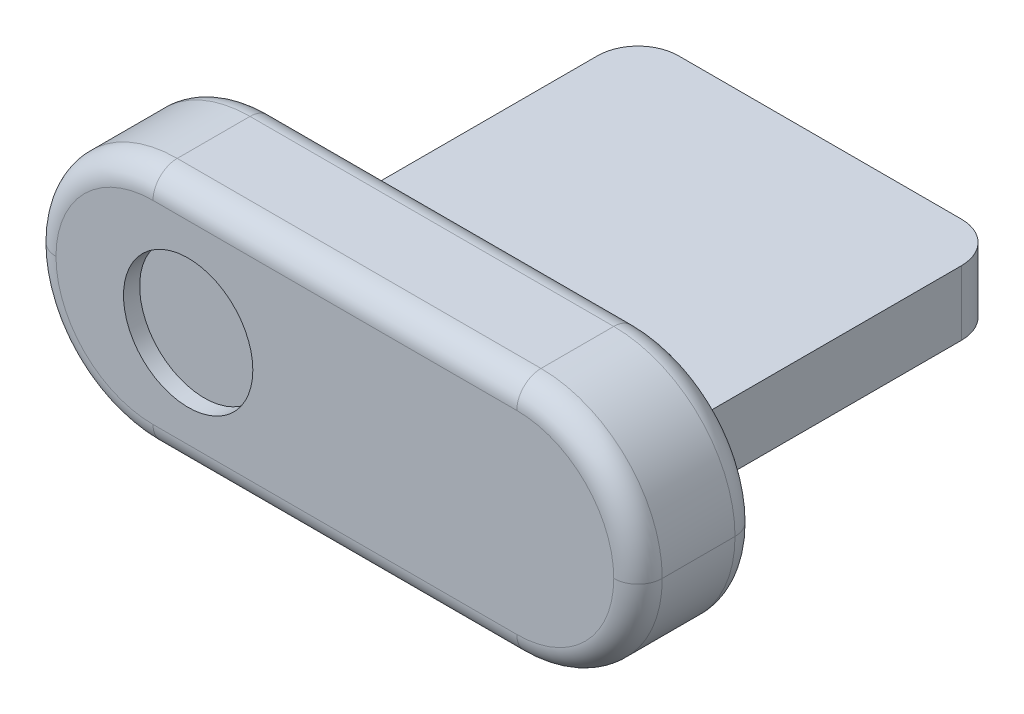
ISO-10303-21;
HEADER;
FILE_DESCRIPTION(('STEP AP214'),'2;1');
FILE_NAME('part.step','',(''),(''),'','','');
FILE_SCHEMA(('AUTOMOTIVE_DESIGN { 1 0 10303 214 1 1 1 1 }'));
ENDSEC;
DATA;
#1=APPLICATION_CONTEXT('core data for automotive mechanical design processes');
#2=APPLICATION_PROTOCOL_DEFINITION('international standard','automotive_design',2000,#1);
#3=PRODUCT_CONTEXT('',#1,'mechanical');
#4=PRODUCT('Part','Part','',(#3));
#5=PRODUCT_RELATED_PRODUCT_CATEGORY('part','',(#4));
#6=PRODUCT_DEFINITION_FORMATION('','',#4);
#7=PRODUCT_DEFINITION_CONTEXT('part definition',#1,'design');
#8=PRODUCT_DEFINITION('design','',#6,#7);
#9=PRODUCT_DEFINITION_SHAPE('','',#8);
#10=(LENGTH_UNIT() NAMED_UNIT(*) SI_UNIT(.MILLI.,.METRE.));
#11=(NAMED_UNIT(*) PLANE_ANGLE_UNIT() SI_UNIT($,.RADIAN.));
#12=(NAMED_UNIT(*) SI_UNIT($,.STERADIAN.) SOLID_ANGLE_UNIT());
#13=UNCERTAINTY_MEASURE_WITH_UNIT(LENGTH_MEASURE(1.E-05),#10,'distance_accuracy_value','');
#14=(GEOMETRIC_REPRESENTATION_CONTEXT(3) GLOBAL_UNCERTAINTY_ASSIGNED_CONTEXT((#13)) GLOBAL_UNIT_ASSIGNED_CONTEXT((#10,
#11,#12)) REPRESENTATION_CONTEXT('',''));
#15=CARTESIAN_POINT('',(0.,0.,0.));
#16=DIRECTION('',(0.,0.,1.));
#17=DIRECTION('',(1.,0.,0.));
#18=AXIS2_PLACEMENT_3D('',#15,#16,#17);
#19=CARTESIAN_POINT('',(0.,0.,-15.));
#20=DIRECTION('',(0.,0.,1.));
#21=DIRECTION('',(1.,0.,0.));
#22=AXIS2_PLACEMENT_3D('',#19,#20,#21);
#23=PLANE('',#22);
#24=DIRECTION('',(-1.,0.,0.));
#25=VECTOR('',#24,1.);
#26=CARTESIAN_POINT('',(-17.5,35.5297881504023,-15.));
#27=LINE('',#26,#25);
#28=CARTESIAN_POINT('',(-62.5,35.5297881504023,-15.));
#29=VERTEX_POINT('',#28);
#30=CARTESIAN_POINT('',(-17.5,35.5297881504023,-15.));
#31=VERTEX_POINT('',#30);
#32=EDGE_CURVE('E237',#29,#31,#27,.F.);
#33=ORIENTED_EDGE('',*,*,#32,.T.);
#34=CARTESIAN_POINT('',(-17.5,23.5297881504023,-15.));
#35=DIRECTION('',(0.,0.,1.));
#36=DIRECTION('',(1.,0.,0.));
#37=AXIS2_PLACEMENT_3D('',#34,#35,#36);
#38=CIRCLE('',#37,12.);
#39=CARTESIAN_POINT('',(-5.50000000000002,23.5297881504023,-15.));
#40=VERTEX_POINT('',#39);
#41=EDGE_CURVE('E250',#31,#40,#38,.F.);
#42=ORIENTED_EDGE('',*,*,#41,.T.);
#43=CARTESIAN_POINT('',(-17.5,23.5297881504024,-15.));
#44=DIRECTION('',(0.,0.,1.));
#45=DIRECTION('',(1.,0.,0.));
#46=AXIS2_PLACEMENT_3D('',#43,#44,#45);
#47=CIRCLE('',#46,12.);
#48=CARTESIAN_POINT('',(-17.5,11.5297881504024,-15.));
#49=VERTEX_POINT('',#48);
#50=EDGE_CURVE('E247',#40,#49,#47,.F.);
#51=ORIENTED_EDGE('',*,*,#50,.T.);
#52=DIRECTION('',(1.,0.,0.));
#53=VECTOR('',#52,1.);
#54=CARTESIAN_POINT('',(-62.5,11.5297881504024,-15.));
#55=LINE('',#54,#53);
#56=CARTESIAN_POINT('',(-62.5,11.5297881504024,-15.));
#57=VERTEX_POINT('',#56);
#58=EDGE_CURVE('E244',#49,#57,#55,.F.);
#59=ORIENTED_EDGE('',*,*,#58,.T.);
#60=CARTESIAN_POINT('',(-62.5,23.5297881504024,-15.));
#61=DIRECTION('',(0.,0.,1.));
#62=DIRECTION('',(1.,0.,0.));
#63=AXIS2_PLACEMENT_3D('',#60,#61,#62);
#64=CIRCLE('',#63,12.);
#65=CARTESIAN_POINT('',(-74.5,23.5297881504024,-15.));
#66=VERTEX_POINT('',#65);
#67=EDGE_CURVE('E242',#57,#66,#64,.F.);
#68=ORIENTED_EDGE('',*,*,#67,.T.);
#69=CARTESIAN_POINT('',(-62.5,23.5297881504024,-15.));
#70=DIRECTION('',(0.,0.,1.));
#71=DIRECTION('',(1.,0.,0.));
#72=AXIS2_PLACEMENT_3D('',#69,#70,#71);
#73=CIRCLE('',#72,12.);
#74=EDGE_CURVE('E240',#66,#29,#73,.F.);
#75=ORIENTED_EDGE('',*,*,#74,.T.);
#76=EDGE_LOOP('',(#33,#42,#51,#59,#68,#75));
#77=FACE_BOUND('',#76,.T.);
#78=DIRECTION('',(0.,-1.,0.));
#79=VECTOR('',#78,1.);
#80=CARTESIAN_POINT('',(-17.5,23.5297881504023,-15.));
#81=LINE('',#80,#79);
#82=CARTESIAN_POINT('',(-17.5,23.5297881504023,-15.));
#83=VERTEX_POINT('',#82);
#84=CARTESIAN_POINT('',(-17.5,15.5297881504023,-15.));
#85=VERTEX_POINT('',#84);
#86=EDGE_CURVE('E176',#83,#85,#81,.T.);
#87=ORIENTED_EDGE('',*,*,#86,.F.);
#88=DIRECTION('',(-1.,0.,0.));
#89=VECTOR('',#88,1.);
#90=CARTESIAN_POINT('',(-17.5,23.5297881504023,-15.));
#91=LINE('',#90,#89);
#92=CARTESIAN_POINT('',(-62.5,23.5297881504023,-15.));
#93=VERTEX_POINT('',#92);
#94=EDGE_CURVE('E189',#83,#93,#91,.T.);
#95=ORIENTED_EDGE('',*,*,#94,.T.);
#96=DIRECTION('',(0.,-1.,0.));
#97=VECTOR('',#96,1.);
#98=CARTESIAN_POINT('',(-62.5,23.5297881504023,-15.));
#99=LINE('',#98,#97);
#100=CARTESIAN_POINT('',(-62.5,15.5297881504023,-15.));
#101=VERTEX_POINT('',#100);
#102=EDGE_CURVE('E187',#93,#101,#99,.T.);
#103=ORIENTED_EDGE('',*,*,#102,.T.);
#104=DIRECTION('',(-1.,0.,0.));
#105=VECTOR('',#104,1.);
#106=CARTESIAN_POINT('',(-17.5,15.5297881504023,-15.));
#107=LINE('',#106,#105);
#108=EDGE_CURVE('E165',#85,#101,#107,.T.);
#109=ORIENTED_EDGE('',*,*,#108,.F.);
#110=EDGE_LOOP('',(#87,#95,#103,#109));
#111=FACE_BOUND('',#110,.T.);
#112=ADVANCED_FACE('F34',(#77,#111),#23,.F.);
#113=CARTESIAN_POINT('',(-77.5,38.5297881504024,-15.));
#114=DIRECTION('',(0.,1.,0.));
#115=DIRECTION('',(-1.,0.,0.));
#116=AXIS2_PLACEMENT_3D('',#113,#114,#115);
#117=PLANE('',#116);
#118=DIRECTION('',(0.,0.,1.));
#119=VECTOR('',#118,1.);
#120=CARTESIAN_POINT('',(-17.5,38.5297881504023,-15.));
#121=LINE('',#120,#119);
#122=CARTESIAN_POINT('',(-17.5,38.5297881504023,-3.));
#123=VERTEX_POINT('',#122);
#124=CARTESIAN_POINT('',(-17.5,38.5297881504023,-12.));
#125=VERTEX_POINT('',#124);
#126=EDGE_CURVE('E210',#123,#125,#121,.F.);
#127=ORIENTED_EDGE('',*,*,#126,.T.);
#128=DIRECTION('',(-1.,0.,0.));
#129=VECTOR('',#128,1.);
#130=CARTESIAN_POINT('',(-62.5,38.5297881504024,-12.));
#131=LINE('',#130,#129);
#132=CARTESIAN_POINT('',(-62.5,38.5297881504024,-12.));
#133=VERTEX_POINT('',#132);
#134=EDGE_CURVE('E11',#125,#133,#131,.T.);
#135=ORIENTED_EDGE('',*,*,#134,.T.);
#136=DIRECTION('',(0.,0.,1.));
#137=VECTOR('',#136,1.);
#138=CARTESIAN_POINT('',(-62.5,38.5297881504024,-15.));
#139=LINE('',#138,#137);
#140=CARTESIAN_POINT('',(-62.5,38.5297881504024,-3.));
#141=VERTEX_POINT('',#140);
#142=EDGE_CURVE('E213',#133,#141,#139,.T.);
#143=ORIENTED_EDGE('',*,*,#142,.T.);
#144=DIRECTION('',(-1.,0.,0.));
#145=VECTOR('',#144,1.);
#146=CARTESIAN_POINT('',(-77.5,38.5297881504024,-3.));
#147=LINE('',#146,#145);
#148=EDGE_CURVE('E43',#141,#123,#147,.F.);
#149=ORIENTED_EDGE('',*,*,#148,.T.);
#150=EDGE_LOOP('',(#127,#135,#143,#149));
#151=FACE_BOUND('',#150,.T.);
#152=ADVANCED_FACE('F391',(#151),#117,.T.);
#153=CARTESIAN_POINT('',(-77.5,8.52978815040235,-15.));
#154=DIRECTION('',(0.,-1.,0.));
#155=DIRECTION('',(0.,0.,-1.));
#156=AXIS2_PLACEMENT_3D('',#153,#154,#155);
#157=PLANE('',#156);
#158=DIRECTION('',(0.,0.,1.));
#159=VECTOR('',#158,1.);
#160=CARTESIAN_POINT('',(-62.5,8.52978815040235,-15.));
#161=LINE('',#160,#159);
#162=CARTESIAN_POINT('',(-62.5,8.52978815040235,-3.));
#163=VERTEX_POINT('',#162);
#164=CARTESIAN_POINT('',(-62.5,8.52978815040235,-12.));
#165=VERTEX_POINT('',#164);
#166=EDGE_CURVE('E206',#163,#165,#161,.F.);
#167=ORIENTED_EDGE('',*,*,#166,.T.);
#168=DIRECTION('',(1.,0.,0.));
#169=VECTOR('',#168,1.);
#170=CARTESIAN_POINT('',(-17.5,8.52978815040235,-12.));
#171=LINE('',#170,#169);
#172=CARTESIAN_POINT('',(-17.5,8.52978815040235,-12.));
#173=VERTEX_POINT('',#172);
#174=EDGE_CURVE('E270',#165,#173,#171,.T.);
#175=ORIENTED_EDGE('',*,*,#174,.T.);
#176=DIRECTION('',(0.,0.,1.));
#177=VECTOR('',#176,1.);
#178=CARTESIAN_POINT('',(-17.5,8.52978815040235,-15.));
#179=LINE('',#178,#177);
#180=CARTESIAN_POINT('',(-17.5,8.52978815040235,-3.));
#181=VERTEX_POINT('',#180);
#182=EDGE_CURVE('E203',#173,#181,#179,.T.);
#183=ORIENTED_EDGE('',*,*,#182,.T.);
#184=DIRECTION('',(1.,0.,0.));
#185=VECTOR('',#184,1.);
#186=CARTESIAN_POINT('',(-77.5,8.52978815040235,-3.));
#187=LINE('',#186,#185);
#188=EDGE_CURVE('E267',#181,#163,#187,.F.);
#189=ORIENTED_EDGE('',*,*,#188,.T.);
#190=EDGE_LOOP('',(#167,#175,#183,#189));
#191=FACE_BOUND('',#190,.T.);
#192=ADVANCED_FACE('F369',(#191),#157,.T.);
#193=CARTESIAN_POINT('',(0.,0.,0.));
#194=DIRECTION('',(0.,0.,1.));
#195=DIRECTION('',(1.,0.,0.));
#196=AXIS2_PLACEMENT_3D('',#193,#194,#195);
#197=PLANE('',#196);
#198=CARTESIAN_POINT('',(-58.1483797005973,23.5297881504024,0.));
#199=DIRECTION('',(0.,0.,1.));
#200=DIRECTION('',(1.,0.,0.));
#201=AXIS2_PLACEMENT_3D('',#198,#199,#200);
#202=CIRCLE('',#201,8.);
#203=CARTESIAN_POINT('',(-50.1483797005973,23.5297881504024,0.));
#204=VERTEX_POINT('',#203);
#205=EDGE_CURVE('E553',#204,#204,#202,.T.);
#206=ORIENTED_EDGE('',*,*,#205,.F.);
#207=EDGE_LOOP('',(#206));
#208=FACE_BOUND('',#207,.T.);
#209=CARTESIAN_POINT('',(-17.5,23.5297881504024,0.));
#210=DIRECTION('',(0.,0.,1.));
#211=DIRECTION('',(1.,0.,0.));
#212=AXIS2_PLACEMENT_3D('',#209,#210,#211);
#213=CIRCLE('',#212,12.);
#214=CARTESIAN_POINT('',(-17.5,11.5297881504024,0.));
#215=VERTEX_POINT('',#214);
#216=CARTESIAN_POINT('',(-5.50000000000002,23.5297881504023,0.));
#217=VERTEX_POINT('',#216);
#218=EDGE_CURVE('E51',#215,#217,#213,.T.);
#219=ORIENTED_EDGE('',*,*,#218,.T.);
#220=CARTESIAN_POINT('',(-17.5,23.5297881504023,0.));
#221=DIRECTION('',(0.,0.,1.));
#222=DIRECTION('',(1.,0.,0.));
#223=AXIS2_PLACEMENT_3D('',#220,#221,#222);
#224=CIRCLE('',#223,12.);
#225=CARTESIAN_POINT('',(-17.5,35.5297881504023,0.));
#226=VERTEX_POINT('',#225);
#227=EDGE_CURVE('E293',#217,#226,#224,.T.);
#228=ORIENTED_EDGE('',*,*,#227,.T.);
#229=DIRECTION('',(-1.,0.,0.));
#230=VECTOR('',#229,1.);
#231=CARTESIAN_POINT('',(0.,35.5297881504023,0.));
#232=LINE('',#231,#230);
#233=CARTESIAN_POINT('',(-62.5,35.5297881504023,0.));
#234=VERTEX_POINT('',#233);
#235=EDGE_CURVE('E283',#226,#234,#232,.T.);
#236=ORIENTED_EDGE('',*,*,#235,.T.);
#237=CARTESIAN_POINT('',(-62.5,23.5297881504024,0.));
#238=DIRECTION('',(0.,0.,1.));
#239=DIRECTION('',(1.,0.,0.));
#240=AXIS2_PLACEMENT_3D('',#237,#238,#239);
#241=CIRCLE('',#240,12.);
#242=CARTESIAN_POINT('',(-74.5,23.5297881504024,0.));
#243=VERTEX_POINT('',#242);
#244=EDGE_CURVE('E286',#234,#243,#241,.T.);
#245=ORIENTED_EDGE('',*,*,#244,.T.);
#246=CARTESIAN_POINT('',(-62.5,23.5297881504024,0.));
#247=DIRECTION('',(0.,0.,1.));
#248=DIRECTION('',(1.,0.,0.));
#249=AXIS2_PLACEMENT_3D('',#246,#247,#248);
#250=CIRCLE('',#249,12.);
#251=CARTESIAN_POINT('',(-62.5,11.5297881504024,0.));
#252=VERTEX_POINT('',#251);
#253=EDGE_CURVE('E288',#243,#252,#250,.T.);
#254=ORIENTED_EDGE('',*,*,#253,.T.);
#255=DIRECTION('',(1.,0.,0.));
#256=VECTOR('',#255,1.);
#257=CARTESIAN_POINT('',(0.,11.5297881504024,0.));
#258=LINE('',#257,#256);
#259=EDGE_CURVE('E56',#252,#215,#258,.T.);
#260=ORIENTED_EDGE('',*,*,#259,.T.);
#261=EDGE_LOOP('',(#219,#228,#236,#245,#254,#260));
#262=FACE_BOUND('',#261,.T.);
#263=ADVANCED_FACE('F421',(#208,#262),#197,.T.);
#264=CARTESIAN_POINT('',(-62.5,23.5297881504024,-15.));
#265=DIRECTION('',(0.,0.,1.));
#266=DIRECTION('',(1.,0.,0.));
#267=AXIS2_PLACEMENT_3D('',#264,#265,#266);
#268=CYLINDRICAL_SURFACE('',#267,15.);
#269=ORIENTED_EDGE('',*,*,#142,.F.);
#270=CARTESIAN_POINT('',(-62.5,23.5297881504024,-12.));
#271=DIRECTION('',(0.,0.,1.));
#272=DIRECTION('',(1.,0.,0.));
#273=AXIS2_PLACEMENT_3D('',#270,#271,#272);
#274=CIRCLE('',#273,15.);
#275=CARTESIAN_POINT('',(-77.5,23.5297881504024,-12.));
#276=VERTEX_POINT('',#275);
#277=EDGE_CURVE('E281',#133,#276,#274,.T.);
#278=ORIENTED_EDGE('',*,*,#277,.T.);
#279=DIRECTION('',(0.,0.,1.));
#280=VECTOR('',#279,1.);
#281=CARTESIAN_POINT('',(-77.5,23.5297881504024,-15.));
#282=LINE('',#281,#280);
#283=CARTESIAN_POINT('',(-77.5,23.5297881504024,-3.));
#284=VERTEX_POINT('',#283);
#285=EDGE_CURVE('E207',#284,#276,#282,.F.);
#286=ORIENTED_EDGE('',*,*,#285,.F.);
#287=CARTESIAN_POINT('',(-62.5,23.5297881504024,-3.));
#288=DIRECTION('',(0.,0.,1.));
#289=DIRECTION('',(1.,0.,0.));
#290=AXIS2_PLACEMENT_3D('',#287,#288,#289);
#291=CIRCLE('',#290,15.);
#292=EDGE_CURVE('E278',#284,#141,#291,.F.);
#293=ORIENTED_EDGE('',*,*,#292,.T.);
#294=EDGE_LOOP('',(#269,#278,#286,#293));
#295=FACE_BOUND('',#294,.T.);
#296=ADVANCED_FACE('F348',(#295),#268,.T.);
#297=CARTESIAN_POINT('',(-62.5,23.5297881504024,-15.));
#298=DIRECTION('',(0.,0.,1.));
#299=DIRECTION('',(1.,0.,0.));
#300=AXIS2_PLACEMENT_3D('',#297,#298,#299);
#301=CYLINDRICAL_SURFACE('',#300,15.);
#302=ORIENTED_EDGE('',*,*,#285,.T.);
#303=CARTESIAN_POINT('',(-62.5,23.5297881504024,-12.));
#304=DIRECTION('',(0.,0.,1.));
#305=DIRECTION('',(1.,0.,0.));
#306=AXIS2_PLACEMENT_3D('',#303,#304,#305);
#307=CIRCLE('',#306,15.);
#308=EDGE_CURVE('E276',#276,#165,#307,.T.);
#309=ORIENTED_EDGE('',*,*,#308,.T.);
#310=ORIENTED_EDGE('',*,*,#166,.F.);
#311=CARTESIAN_POINT('',(-62.5,23.5297881504024,-3.));
#312=DIRECTION('',(0.,0.,1.));
#313=DIRECTION('',(1.,0.,0.));
#314=AXIS2_PLACEMENT_3D('',#311,#312,#313);
#315=CIRCLE('',#314,15.);
#316=EDGE_CURVE('E273',#163,#284,#315,.F.);
#317=ORIENTED_EDGE('',*,*,#316,.T.);
#318=EDGE_LOOP('',(#302,#309,#310,#317));
#319=FACE_BOUND('',#318,.T.);
#320=ADVANCED_FACE('F344',(#319),#301,.T.);
#321=CARTESIAN_POINT('',(-17.5,23.5297881504023,-15.));
#322=DIRECTION('',(0.,0.,1.));
#323=DIRECTION('',(1.,0.,0.));
#324=AXIS2_PLACEMENT_3D('',#321,#322,#323);
#325=CYLINDRICAL_SURFACE('',#324,15.);
#326=DIRECTION('',(0.,0.,1.));
#327=VECTOR('',#326,1.);
#328=CARTESIAN_POINT('',(-2.50000000000002,23.5297881504023,-15.));
#329=LINE('',#328,#327);
#330=CARTESIAN_POINT('',(-2.50000000000002,23.5297881504023,-12.));
#331=VERTEX_POINT('',#330);
#332=CARTESIAN_POINT('',(-2.50000000000002,23.5297881504023,-3.));
#333=VERTEX_POINT('',#332);
#334=EDGE_CURVE('E172',#331,#333,#329,.T.);
#335=ORIENTED_EDGE('',*,*,#334,.F.);
#336=CARTESIAN_POINT('',(-17.5,23.5297881504023,-12.));
#337=DIRECTION('',(0.,0.,1.));
#338=DIRECTION('',(1.,0.,0.));
#339=AXIS2_PLACEMENT_3D('',#336,#337,#338);
#340=CIRCLE('',#339,15.);
#341=EDGE_CURVE('E258',#331,#125,#340,.T.);
#342=ORIENTED_EDGE('',*,*,#341,.T.);
#343=ORIENTED_EDGE('',*,*,#126,.F.);
#344=CARTESIAN_POINT('',(-17.5,23.5297881504023,-3.));
#345=DIRECTION('',(0.,0.,1.));
#346=DIRECTION('',(1.,0.,0.));
#347=AXIS2_PLACEMENT_3D('',#344,#345,#346);
#348=CIRCLE('',#347,15.);
#349=EDGE_CURVE('E254',#123,#333,#348,.F.);
#350=ORIENTED_EDGE('',*,*,#349,.T.);
#351=EDGE_LOOP('',(#335,#342,#343,#350));
#352=FACE_BOUND('',#351,.T.);
#353=ADVANCED_FACE('F388',(#352),#325,.T.);
#354=CARTESIAN_POINT('',(-17.5,23.5297881504024,-15.));
#355=DIRECTION('',(0.,0.,1.));
#356=DIRECTION('',(1.,0.,0.));
#357=AXIS2_PLACEMENT_3D('',#354,#355,#356);
#358=CYLINDRICAL_SURFACE('',#357,15.);
#359=ORIENTED_EDGE('',*,*,#182,.F.);
#360=CARTESIAN_POINT('',(-17.5,23.5297881504024,-12.));
#361=DIRECTION('',(0.,0.,1.));
#362=DIRECTION('',(1.,0.,0.));
#363=AXIS2_PLACEMENT_3D('',#360,#361,#362);
#364=CIRCLE('',#363,15.);
#365=EDGE_CURVE('E264',#173,#331,#364,.T.);
#366=ORIENTED_EDGE('',*,*,#365,.T.);
#367=ORIENTED_EDGE('',*,*,#334,.T.);
#368=CARTESIAN_POINT('',(-17.5,23.5297881504024,-3.));
#369=DIRECTION('',(0.,0.,1.));
#370=DIRECTION('',(1.,0.,0.));
#371=AXIS2_PLACEMENT_3D('',#368,#369,#370);
#372=CIRCLE('',#371,15.);
#373=EDGE_CURVE('E262',#333,#181,#372,.F.);
#374=ORIENTED_EDGE('',*,*,#373,.T.);
#375=EDGE_LOOP('',(#359,#366,#367,#374));
#376=FACE_BOUND('',#375,.T.);
#377=ADVANCED_FACE('F373',(#376),#358,.T.);
#378=CARTESIAN_POINT('',(-17.5,23.5297881504023,-60.));
#379=DIRECTION('',(-1.,0.,0.));
#380=DIRECTION('',(0.,0.,1.));
#381=AXIS2_PLACEMENT_3D('',#378,#379,#380);
#382=PLANE('',#381);
#383=DIRECTION('',(0.,0.,1.));
#384=VECTOR('',#383,1.);
#385=CARTESIAN_POINT('',(-17.5,15.5297881504023,-60.));
#386=LINE('',#385,#384);
#387=CARTESIAN_POINT('',(-17.5,15.5297881504023,-55.));
#388=VERTEX_POINT('',#387);
#389=EDGE_CURVE('E160',#388,#85,#386,.T.);
#390=ORIENTED_EDGE('',*,*,#389,.F.);
#391=DIRECTION('',(0.,-1.,0.));
#392=VECTOR('',#391,1.);
#393=CARTESIAN_POINT('',(-17.5,23.5297881504023,-55.));
#394=LINE('',#393,#392);
#395=CARTESIAN_POINT('',(-17.5,23.5297881504023,-55.));
#396=VERTEX_POINT('',#395);
#397=EDGE_CURVE('E235',#388,#396,#394,.F.);
#398=ORIENTED_EDGE('',*,*,#397,.T.);
#399=DIRECTION('',(0.,0.,1.));
#400=VECTOR('',#399,1.);
#401=CARTESIAN_POINT('',(-17.5,23.5297881504023,-60.));
#402=LINE('',#401,#400);
#403=EDGE_CURVE('E179',#396,#83,#402,.T.);
#404=ORIENTED_EDGE('',*,*,#403,.T.);
#405=ORIENTED_EDGE('',*,*,#86,.T.);
#406=EDGE_LOOP('',(#390,#398,#404,#405));
#407=FACE_BOUND('',#406,.T.);
#408=ADVANCED_FACE('F177',(#407),#382,.F.);
#409=CARTESIAN_POINT('',(-17.5,15.5297881504023,-60.));
#410=DIRECTION('',(0.,1.,0.));
#411=DIRECTION('',(0.,0.,1.));
#412=AXIS2_PLACEMENT_3D('',#409,#410,#411);
#413=PLANE('',#412);
#414=DIRECTION('',(0.,0.,1.));
#415=VECTOR('',#414,1.);
#416=CARTESIAN_POINT('',(-62.5,15.5297881504023,-60.));
#417=LINE('',#416,#415);
#418=CARTESIAN_POINT('',(-62.5,15.5297881504023,-55.));
#419=VERTEX_POINT('',#418);
#420=EDGE_CURVE('E173',#419,#101,#417,.T.);
#421=ORIENTED_EDGE('',*,*,#420,.F.);
#422=CARTESIAN_POINT('',(-57.5,15.5297881504023,-55.));
#423=DIRECTION('',(0.,1.,0.));
#424=DIRECTION('',(0.,0.,1.));
#425=AXIS2_PLACEMENT_3D('',#422,#423,#424);
#426=CIRCLE('',#425,5.);
#427=CARTESIAN_POINT('',(-57.5,15.5297881504023,-60.));
#428=VERTEX_POINT('',#427);
#429=EDGE_CURVE('E224',#419,#428,#426,.F.);
#430=ORIENTED_EDGE('',*,*,#429,.T.);
#431=DIRECTION('',(-1.,0.,0.));
#432=VECTOR('',#431,1.);
#433=CARTESIAN_POINT('',(-17.5,15.5297881504023,-60.));
#434=LINE('',#433,#432);
#435=CARTESIAN_POINT('',(-22.5,15.5297881504023,-60.));
#436=VERTEX_POINT('',#435);
#437=EDGE_CURVE('E194',#436,#428,#434,.T.);
#438=ORIENTED_EDGE('',*,*,#437,.F.);
#439=CARTESIAN_POINT('',(-22.5,15.5297881504023,-55.));
#440=DIRECTION('',(0.,1.,0.));
#441=DIRECTION('',(0.,0.,1.));
#442=AXIS2_PLACEMENT_3D('',#439,#440,#441);
#443=CIRCLE('',#442,5.);
#444=EDGE_CURVE('E168',#436,#388,#443,.F.);
#445=ORIENTED_EDGE('',*,*,#444,.T.);
#446=ORIENTED_EDGE('',*,*,#389,.T.);
#447=ORIENTED_EDGE('',*,*,#108,.T.);
#448=EDGE_LOOP('',(#421,#430,#438,#445,#446,#447));
#449=FACE_BOUND('',#448,.T.);
#450=ADVANCED_FACE('F163',(#449),#413,.F.);
#451=CARTESIAN_POINT('',(-62.5,23.5297881504023,-60.));
#452=DIRECTION('',(-1.,0.,0.));
#453=DIRECTION('',(0.,0.,1.));
#454=AXIS2_PLACEMENT_3D('',#451,#452,#453);
#455=PLANE('',#454);
#456=DIRECTION('',(0.,0.,1.));
#457=VECTOR('',#456,1.);
#458=CARTESIAN_POINT('',(-62.5,23.5297881504023,-60.));
#459=LINE('',#458,#457);
#460=CARTESIAN_POINT('',(-62.5,23.5297881504023,-55.));
#461=VERTEX_POINT('',#460);
#462=EDGE_CURVE('E197',#461,#93,#459,.T.);
#463=ORIENTED_EDGE('',*,*,#462,.F.);
#464=DIRECTION('',(0.,-1.,0.));
#465=VECTOR('',#464,1.);
#466=CARTESIAN_POINT('',(-62.5,23.5297881504023,-55.));
#467=LINE('',#466,#465);
#468=EDGE_CURVE('E216',#461,#419,#467,.T.);
#469=ORIENTED_EDGE('',*,*,#468,.T.);
#470=ORIENTED_EDGE('',*,*,#420,.T.);
#471=ORIENTED_EDGE('',*,*,#102,.F.);
#472=EDGE_LOOP('',(#463,#469,#470,#471));
#473=FACE_BOUND('',#472,.T.);
#474=ADVANCED_FACE('F478',(#473),#455,.T.);
#475=CARTESIAN_POINT('',(-17.5,23.5297881504023,-60.));
#476=DIRECTION('',(0.,1.,0.));
#477=DIRECTION('',(0.,0.,1.));
#478=AXIS2_PLACEMENT_3D('',#475,#476,#477);
#479=PLANE('',#478);
#480=DIRECTION('',(-1.,0.,0.));
#481=VECTOR('',#480,1.);
#482=CARTESIAN_POINT('',(-17.5,23.5297881504023,-60.));
#483=LINE('',#482,#481);
#484=CARTESIAN_POINT('',(-22.5,23.5297881504023,-60.));
#485=VERTEX_POINT('',#484);
#486=CARTESIAN_POINT('',(-57.5,23.5297881504023,-60.));
#487=VERTEX_POINT('',#486);
#488=EDGE_CURVE('E198',#485,#487,#483,.T.);
#489=ORIENTED_EDGE('',*,*,#488,.T.);
#490=CARTESIAN_POINT('',(-57.5,23.5297881504023,-55.));
#491=DIRECTION('',(0.,1.,0.));
#492=DIRECTION('',(0.,0.,1.));
#493=AXIS2_PLACEMENT_3D('',#490,#491,#492);
#494=CIRCLE('',#493,5.);
#495=EDGE_CURVE('E233',#487,#461,#494,.T.);
#496=ORIENTED_EDGE('',*,*,#495,.T.);
#497=ORIENTED_EDGE('',*,*,#462,.T.);
#498=ORIENTED_EDGE('',*,*,#94,.F.);
#499=ORIENTED_EDGE('',*,*,#403,.F.);
#500=CARTESIAN_POINT('',(-22.5,23.5297881504023,-55.));
#501=DIRECTION('',(0.,1.,0.));
#502=DIRECTION('',(0.,0.,1.));
#503=AXIS2_PLACEMENT_3D('',#500,#501,#502);
#504=CIRCLE('',#503,5.);
#505=EDGE_CURVE('E231',#396,#485,#504,.T.);
#506=ORIENTED_EDGE('',*,*,#505,.T.);
#507=EDGE_LOOP('',(#489,#496,#497,#498,#499,#506));
#508=FACE_BOUND('',#507,.T.);
#509=ADVANCED_FACE('F474',(#508),#479,.T.);
#510=CARTESIAN_POINT('',(0.,0.,-60.));
#511=DIRECTION('',(0.,0.,-1.));
#512=DIRECTION('',(-1.,0.,0.));
#513=AXIS2_PLACEMENT_3D('',#510,#511,#512);
#514=PLANE('',#513);
#515=ORIENTED_EDGE('',*,*,#437,.T.);
#516=DIRECTION('',(0.,-1.,0.));
#517=VECTOR('',#516,1.);
#518=CARTESIAN_POINT('',(-57.5,0.,-60.));
#519=LINE('',#518,#517);
#520=EDGE_CURVE('E229',#428,#487,#519,.F.);
#521=ORIENTED_EDGE('',*,*,#520,.T.);
#522=ORIENTED_EDGE('',*,*,#488,.F.);
#523=DIRECTION('',(0.,-1.,0.));
#524=VECTOR('',#523,1.);
#525=CARTESIAN_POINT('',(-22.5,15.5297881504023,-60.));
#526=LINE('',#525,#524);
#527=EDGE_CURVE('E226',#485,#436,#526,.T.);
#528=ORIENTED_EDGE('',*,*,#527,.T.);
#529=EDGE_LOOP('',(#515,#521,#522,#528));
#530=FACE_BOUND('',#529,.T.);
#531=ADVANCED_FACE('F439',(#530),#514,.T.);
#532=CARTESIAN_POINT('',(-57.5,23.5297881504023,-55.));
#533=DIRECTION('',(0.,-1.,0.));
#534=DIRECTION('',(0.,0.,-1.));
#535=AXIS2_PLACEMENT_3D('',#532,#533,#534);
#536=CYLINDRICAL_SURFACE('',#535,5.);
#537=ORIENTED_EDGE('',*,*,#495,.F.);
#538=ORIENTED_EDGE('',*,*,#520,.F.);
#539=ORIENTED_EDGE('',*,*,#429,.F.);
#540=ORIENTED_EDGE('',*,*,#468,.F.);
#541=EDGE_LOOP('',(#537,#538,#539,#540));
#542=FACE_BOUND('',#541,.T.);
#543=ADVANCED_FACE('F435',(#542),#536,.T.);
#544=CARTESIAN_POINT('',(-22.5,0.,-55.));
#545=DIRECTION('',(0.,1.,0.));
#546=DIRECTION('',(0.,0.,1.));
#547=AXIS2_PLACEMENT_3D('',#544,#545,#546);
#548=CYLINDRICAL_SURFACE('',#547,5.);
#549=ORIENTED_EDGE('',*,*,#505,.F.);
#550=ORIENTED_EDGE('',*,*,#397,.F.);
#551=ORIENTED_EDGE('',*,*,#444,.F.);
#552=ORIENTED_EDGE('',*,*,#527,.F.);
#553=EDGE_LOOP('',(#549,#550,#551,#552));
#554=FACE_BOUND('',#553,.T.);
#555=ADVANCED_FACE('F438',(#554),#548,.T.);
#556=CARTESIAN_POINT('',(-62.5,23.5297881504024,-12.));
#557=DIRECTION('',(0.,0.,1.));
#558=DIRECTION('',(1.,0.,0.));
#559=AXIS2_PLACEMENT_3D('',#556,#557,#558);
#560=TOROIDAL_SURFACE('',#559,12.,3.);
#561=CARTESIAN_POINT('',(-62.5,11.5297881504024,-12.));
#562=DIRECTION('',(1.,0.,0.));
#563=DIRECTION('',(0.,0.,-1.));
#564=AXIS2_PLACEMENT_3D('',#561,#562,#563);
#565=CIRCLE('',#564,3.);
#566=EDGE_CURVE('E309',#165,#57,#565,.T.);
#567=ORIENTED_EDGE('',*,*,#566,.F.);
#568=ORIENTED_EDGE('',*,*,#308,.F.);
#569=CARTESIAN_POINT('',(-74.5,23.5297881504024,-12.));
#570=DIRECTION('',(0.,1.,0.));
#571=DIRECTION('',(0.,0.,1.));
#572=AXIS2_PLACEMENT_3D('',#569,#570,#571);
#573=CIRCLE('',#572,3.);
#574=EDGE_CURVE('E184',#66,#276,#573,.T.);
#575=ORIENTED_EDGE('',*,*,#574,.F.);
#576=ORIENTED_EDGE('',*,*,#67,.F.);
#577=EDGE_LOOP('',(#567,#568,#575,#576));
#578=FACE_BOUND('',#577,.T.);
#579=ADVANCED_FACE('F366',(#578),#560,.T.);
#580=CARTESIAN_POINT('',(-62.5,23.5297881504024,-12.));
#581=DIRECTION('',(0.,0.,1.));
#582=DIRECTION('',(1.,0.,0.));
#583=AXIS2_PLACEMENT_3D('',#580,#581,#582);
#584=TOROIDAL_SURFACE('',#583,12.,3.);
#585=ORIENTED_EDGE('',*,*,#574,.T.);
#586=ORIENTED_EDGE('',*,*,#277,.F.);
#587=CARTESIAN_POINT('',(-62.5,35.5297881504023,-12.));
#588=DIRECTION('',(1.,0.,0.));
#589=DIRECTION('',(0.,0.,-1.));
#590=AXIS2_PLACEMENT_3D('',#587,#588,#589);
#591=CIRCLE('',#590,3.);
#592=EDGE_CURVE('E306',#29,#133,#591,.T.);
#593=ORIENTED_EDGE('',*,*,#592,.F.);
#594=ORIENTED_EDGE('',*,*,#74,.F.);
#595=EDGE_LOOP('',(#585,#586,#593,#594));
#596=FACE_BOUND('',#595,.T.);
#597=ADVANCED_FACE('F352',(#596),#584,.T.);
#598=CARTESIAN_POINT('',(-77.5,11.5297881504024,-12.));
#599=DIRECTION('',(-1.,0.,0.));
#600=DIRECTION('',(0.,0.,1.));
#601=AXIS2_PLACEMENT_3D('',#598,#599,#600);
#602=CYLINDRICAL_SURFACE('',#601,3.);
#603=ORIENTED_EDGE('',*,*,#566,.T.);
#604=ORIENTED_EDGE('',*,*,#58,.F.);
#605=CARTESIAN_POINT('',(-17.5,11.5297881504024,-12.));
#606=DIRECTION('',(1.,0.,0.));
#607=DIRECTION('',(0.,0.,-1.));
#608=AXIS2_PLACEMENT_3D('',#605,#606,#607);
#609=CIRCLE('',#608,3.);
#610=EDGE_CURVE('E303',#173,#49,#609,.T.);
#611=ORIENTED_EDGE('',*,*,#610,.F.);
#612=ORIENTED_EDGE('',*,*,#174,.F.);
#613=EDGE_LOOP('',(#603,#604,#611,#612));
#614=FACE_BOUND('',#613,.T.);
#615=ADVANCED_FACE('F378',(#614),#602,.T.);
#616=CARTESIAN_POINT('',(-77.5,35.5297881504023,-12.));
#617=DIRECTION('',(1.,0.,0.));
#618=DIRECTION('',(0.,1.,0.));
#619=AXIS2_PLACEMENT_3D('',#616,#617,#618);
#620=CYLINDRICAL_SURFACE('',#619,3.);
#621=ORIENTED_EDGE('',*,*,#592,.T.);
#622=ORIENTED_EDGE('',*,*,#134,.F.);
#623=CARTESIAN_POINT('',(-17.5,35.5297881504023,-12.));
#624=DIRECTION('',(1.,0.,0.));
#625=DIRECTION('',(0.,0.,-1.));
#626=AXIS2_PLACEMENT_3D('',#623,#624,#625);
#627=CIRCLE('',#626,3.);
#628=EDGE_CURVE('E301',#31,#125,#627,.T.);
#629=ORIENTED_EDGE('',*,*,#628,.F.);
#630=ORIENTED_EDGE('',*,*,#32,.F.);
#631=EDGE_LOOP('',(#621,#622,#629,#630));
#632=FACE_BOUND('',#631,.T.);
#633=ADVANCED_FACE('F358',(#632),#620,.T.);
#634=CARTESIAN_POINT('',(-17.5,23.5297881504024,-12.));
#635=DIRECTION('',(0.,0.,1.));
#636=DIRECTION('',(1.,0.,0.));
#637=AXIS2_PLACEMENT_3D('',#634,#635,#636);
#638=TOROIDAL_SURFACE('',#637,12.,3.);
#639=ORIENTED_EDGE('',*,*,#610,.T.);
#640=ORIENTED_EDGE('',*,*,#50,.F.);
#641=CARTESIAN_POINT('',(-5.50000000000002,23.5297881504023,-12.));
#642=DIRECTION('',(0.,1.,0.));
#643=DIRECTION('',(0.,0.,1.));
#644=AXIS2_PLACEMENT_3D('',#641,#642,#643);
#645=CIRCLE('',#644,3.);
#646=EDGE_CURVE('E298',#331,#40,#645,.T.);
#647=ORIENTED_EDGE('',*,*,#646,.F.);
#648=ORIENTED_EDGE('',*,*,#365,.F.);
#649=EDGE_LOOP('',(#639,#640,#647,#648));
#650=FACE_BOUND('',#649,.T.);
#651=ADVANCED_FACE('F382',(#650),#638,.T.);
#652=CARTESIAN_POINT('',(-17.5,23.5297881504023,-12.));
#653=DIRECTION('',(0.,0.,1.));
#654=DIRECTION('',(1.,0.,0.));
#655=AXIS2_PLACEMENT_3D('',#652,#653,#654);
#656=TOROIDAL_SURFACE('',#655,12.,3.);
#657=ORIENTED_EDGE('',*,*,#628,.T.);
#658=ORIENTED_EDGE('',*,*,#341,.F.);
#659=ORIENTED_EDGE('',*,*,#646,.T.);
#660=ORIENTED_EDGE('',*,*,#41,.F.);
#661=EDGE_LOOP('',(#657,#658,#659,#660));
#662=FACE_BOUND('',#661,.T.);
#663=ADVANCED_FACE('F385',(#662),#656,.T.);
#664=CARTESIAN_POINT('',(-62.5,23.5297881504024,-3.));
#665=DIRECTION('',(0.,0.,1.));
#666=DIRECTION('',(1.,0.,0.));
#667=AXIS2_PLACEMENT_3D('',#664,#665,#666);
#668=TOROIDAL_SURFACE('',#667,12.,3.);
#669=CARTESIAN_POINT('',(-74.5,23.5297881504024,-3.));
#670=DIRECTION('',(0.,1.,0.));
#671=DIRECTION('',(0.,0.,1.));
#672=AXIS2_PLACEMENT_3D('',#669,#670,#671);
#673=CIRCLE('',#672,3.);
#674=EDGE_CURVE('E327',#284,#243,#673,.T.);
#675=ORIENTED_EDGE('',*,*,#674,.F.);
#676=ORIENTED_EDGE('',*,*,#316,.F.);
#677=CARTESIAN_POINT('',(-62.5,11.5297881504024,-3.));
#678=DIRECTION('',(1.,0.,0.));
#679=DIRECTION('',(0.,0.,-1.));
#680=AXIS2_PLACEMENT_3D('',#677,#678,#679);
#681=CIRCLE('',#680,3.);
#682=EDGE_CURVE('E38',#252,#163,#681,.T.);
#683=ORIENTED_EDGE('',*,*,#682,.F.);
#684=ORIENTED_EDGE('',*,*,#253,.F.);
#685=EDGE_LOOP('',(#675,#676,#683,#684));
#686=FACE_BOUND('',#685,.T.);
#687=ADVANCED_FACE('F36',(#686),#668,.T.);
#688=CARTESIAN_POINT('',(0.,11.5297881504024,-3.));
#689=DIRECTION('',(1.,0.,0.));
#690=DIRECTION('',(0.,0.,-1.));
#691=AXIS2_PLACEMENT_3D('',#688,#689,#690);
#692=CYLINDRICAL_SURFACE('',#691,3.);
#693=ORIENTED_EDGE('',*,*,#682,.T.);
#694=ORIENTED_EDGE('',*,*,#188,.F.);
#695=CARTESIAN_POINT('',(-17.5,11.5297881504024,-3.));
#696=DIRECTION('',(1.,0.,0.));
#697=DIRECTION('',(0.,0.,-1.));
#698=AXIS2_PLACEMENT_3D('',#695,#696,#697);
#699=CIRCLE('',#698,3.);
#700=EDGE_CURVE('E324',#215,#181,#699,.T.);
#701=ORIENTED_EDGE('',*,*,#700,.F.);
#702=ORIENTED_EDGE('',*,*,#259,.F.);
#703=EDGE_LOOP('',(#693,#694,#701,#702));
#704=FACE_BOUND('',#703,.T.);
#705=ADVANCED_FACE('F337',(#704),#692,.T.);
#706=CARTESIAN_POINT('',(-62.5,23.5297881504024,-3.));
#707=DIRECTION('',(0.,0.,1.));
#708=DIRECTION('',(1.,0.,0.));
#709=AXIS2_PLACEMENT_3D('',#706,#707,#708);
#710=TOROIDAL_SURFACE('',#709,12.,3.);
#711=ORIENTED_EDGE('',*,*,#674,.T.);
#712=ORIENTED_EDGE('',*,*,#244,.F.);
#713=CARTESIAN_POINT('',(-62.5,35.5297881504023,-3.));
#714=DIRECTION('',(1.,0.,0.));
#715=DIRECTION('',(0.,0.,-1.));
#716=AXIS2_PLACEMENT_3D('',#713,#714,#715);
#717=CIRCLE('',#716,3.);
#718=EDGE_CURVE('E321',#141,#234,#717,.T.);
#719=ORIENTED_EDGE('',*,*,#718,.F.);
#720=ORIENTED_EDGE('',*,*,#292,.F.);
#721=EDGE_LOOP('',(#711,#712,#719,#720));
#722=FACE_BOUND('',#721,.T.);
#723=ADVANCED_FACE('F404',(#722),#710,.T.);
#724=CARTESIAN_POINT('',(-17.5,23.5297881504024,-3.));
#725=DIRECTION('',(0.,0.,1.));
#726=DIRECTION('',(1.,0.,0.));
#727=AXIS2_PLACEMENT_3D('',#724,#725,#726);
#728=TOROIDAL_SURFACE('',#727,12.,3.);
#729=ORIENTED_EDGE('',*,*,#700,.T.);
#730=ORIENTED_EDGE('',*,*,#373,.F.);
#731=CARTESIAN_POINT('',(-5.50000000000002,23.5297881504023,-3.));
#732=DIRECTION('',(0.,1.,0.));
#733=DIRECTION('',(0.,0.,1.));
#734=AXIS2_PLACEMENT_3D('',#731,#732,#733);
#735=CIRCLE('',#734,3.);
#736=EDGE_CURVE('E318',#217,#333,#735,.T.);
#737=ORIENTED_EDGE('',*,*,#736,.F.);
#738=ORIENTED_EDGE('',*,*,#218,.F.);
#739=EDGE_LOOP('',(#729,#730,#737,#738));
#740=FACE_BOUND('',#739,.T.);
#741=ADVANCED_FACE('F402',(#740),#728,.T.);
#742=CARTESIAN_POINT('',(0.,35.5297881504023,-3.));
#743=DIRECTION('',(-1.,0.,0.));
#744=DIRECTION('',(0.,-1.,0.));
#745=AXIS2_PLACEMENT_3D('',#742,#743,#744);
#746=CYLINDRICAL_SURFACE('',#745,3.);
#747=ORIENTED_EDGE('',*,*,#718,.T.);
#748=ORIENTED_EDGE('',*,*,#235,.F.);
#749=CARTESIAN_POINT('',(-17.5,35.5297881504023,-3.));
#750=DIRECTION('',(1.,0.,0.));
#751=DIRECTION('',(0.,0.,-1.));
#752=AXIS2_PLACEMENT_3D('',#749,#750,#751);
#753=CIRCLE('',#752,3.);
#754=EDGE_CURVE('E316',#123,#226,#753,.T.);
#755=ORIENTED_EDGE('',*,*,#754,.F.);
#756=ORIENTED_EDGE('',*,*,#148,.F.);
#757=EDGE_LOOP('',(#747,#748,#755,#756));
#758=FACE_BOUND('',#757,.T.);
#759=ADVANCED_FACE('F396',(#758),#746,.T.);
#760=CARTESIAN_POINT('',(-17.5,23.5297881504023,-3.));
#761=DIRECTION('',(0.,0.,1.));
#762=DIRECTION('',(1.,0.,0.));
#763=AXIS2_PLACEMENT_3D('',#760,#761,#762);
#764=TOROIDAL_SURFACE('',#763,12.,3.);
#765=ORIENTED_EDGE('',*,*,#736,.T.);
#766=ORIENTED_EDGE('',*,*,#349,.F.);
#767=ORIENTED_EDGE('',*,*,#754,.T.);
#768=ORIENTED_EDGE('',*,*,#227,.F.);
#769=EDGE_LOOP('',(#765,#766,#767,#768));
#770=FACE_BOUND('',#769,.T.);
#771=ADVANCED_FACE('F400',(#770),#764,.T.);
#772=CARTESIAN_POINT('',(-58.1483797005973,23.5297881504024,-2.));
#773=DIRECTION('',(0.,0.,1.));
#774=DIRECTION('',(1.,0.,0.));
#775=AXIS2_PLACEMENT_3D('',#772,#773,#774);
#776=CYLINDRICAL_SURFACE('',#775,8.);
#777=CARTESIAN_POINT('',(-58.1483797005973,23.5297881504024,-2.));
#778=DIRECTION('',(0.,0.,1.));
#779=DIRECTION('',(1.,0.,0.));
#780=AXIS2_PLACEMENT_3D('',#777,#778,#779);
#781=CIRCLE('',#780,8.);
#782=CARTESIAN_POINT('',(-50.1483797005973,23.5297881504024,-2.));
#783=VERTEX_POINT('',#782);
#784=EDGE_CURVE('E319',#783,#783,#781,.T.);
#785=ORIENTED_EDGE('',*,*,#784,.F.);
#786=EDGE_LOOP('',(#785));
#787=FACE_BOUND('',#786,.T.);
#788=ORIENTED_EDGE('',*,*,#205,.T.);
#789=EDGE_LOOP('',(#788));
#790=FACE_BOUND('',#789,.T.);
#791=ADVANCED_FACE('F457',(#787,#790),#776,.F.);
#792=CARTESIAN_POINT('',(-58.1483797005973,23.5297881504024,-2.));
#793=DIRECTION('',(0.,0.,1.));
#794=DIRECTION('',(1.,0.,0.));
#795=AXIS2_PLACEMENT_3D('',#792,#793,#794);
#796=PLANE('',#795);
#797=ORIENTED_EDGE('',*,*,#784,.T.);
#798=EDGE_LOOP('',(#797));
#799=FACE_BOUND('',#798,.T.);
#800=ADVANCED_FACE('F461',(#799),#796,.T.);
#801=CLOSED_SHELL('',(#112,#152,#192,#263,#296,#320,#353,#377,#408,#450,#474,#509,#531,#543,
#555,#579,#597,#615,#633,#651,#663,#687,#705,#723,#741,#759,#771,#791,#800));
#802=MANIFOLD_SOLID_BREP('B2',#801);
#803=ADVANCED_BREP_SHAPE_REPRESENTATION('',(#18,#802),#14);
#804=SHAPE_DEFINITION_REPRESENTATION(#9,#803);
ENDSEC;
END-ISO-10303-21;
